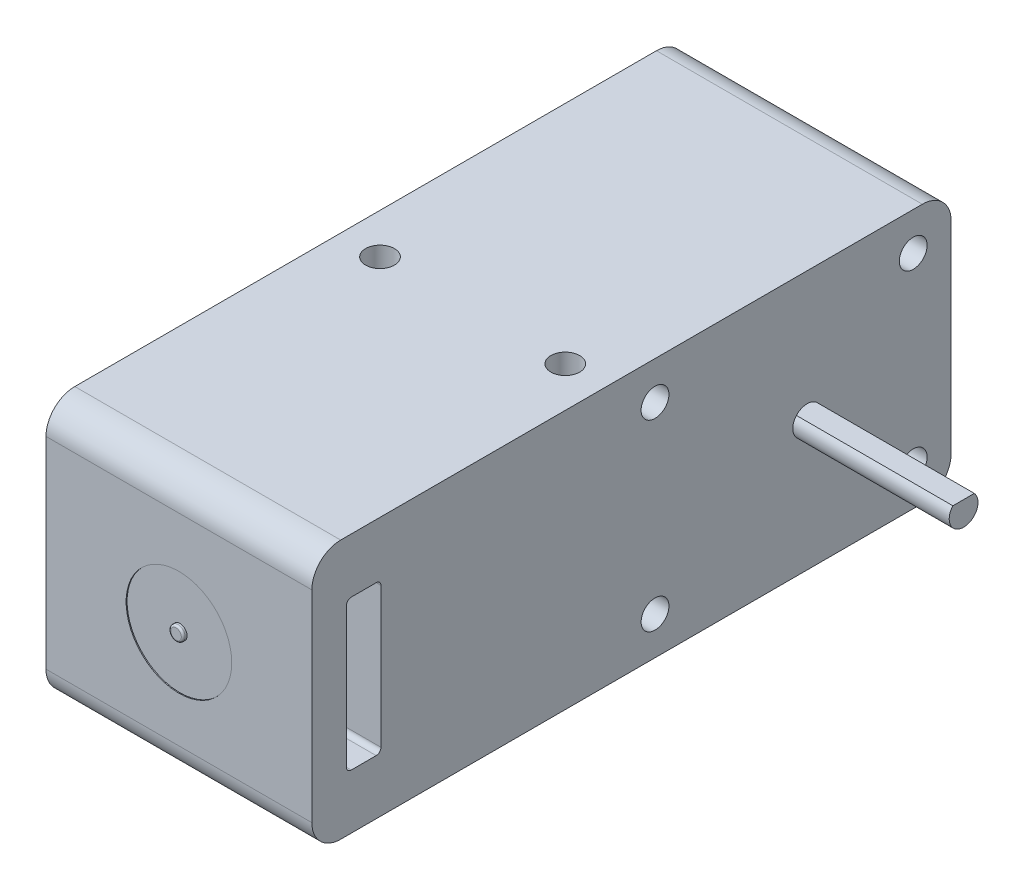
ISO-10303-21;
HEADER;
FILE_DESCRIPTION(('STEP AP214'),'2;1');
FILE_NAME('part.step','',(''),(''),'','','');
FILE_SCHEMA(('AUTOMOTIVE_DESIGN { 1 0 10303 214 1 1 1 1 }'));
ENDSEC;
DATA;
#1=APPLICATION_CONTEXT('core data for automotive mechanical design processes');
#2=APPLICATION_PROTOCOL_DEFINITION('international standard','automotive_design',2000,#1);
#3=PRODUCT_CONTEXT('',#1,'mechanical');
#4=PRODUCT('Part','Part','',(#3));
#5=PRODUCT_RELATED_PRODUCT_CATEGORY('part','',(#4));
#6=PRODUCT_DEFINITION_FORMATION('','',#4);
#7=PRODUCT_DEFINITION_CONTEXT('part definition',#1,'design');
#8=PRODUCT_DEFINITION('design','',#6,#7);
#9=PRODUCT_DEFINITION_SHAPE('','',#8);
#10=(LENGTH_UNIT() NAMED_UNIT(*) SI_UNIT(.MILLI.,.METRE.));
#11=(NAMED_UNIT(*) PLANE_ANGLE_UNIT() SI_UNIT($,.RADIAN.));
#12=(NAMED_UNIT(*) SI_UNIT($,.STERADIAN.) SOLID_ANGLE_UNIT());
#13=UNCERTAINTY_MEASURE_WITH_UNIT(LENGTH_MEASURE(1.E-05),#10,'distance_accuracy_value','');
#14=(GEOMETRIC_REPRESENTATION_CONTEXT(3) GLOBAL_UNCERTAINTY_ASSIGNED_CONTEXT((#13)) GLOBAL_UNIT_ASSIGNED_CONTEXT((#10,
#11,#12)) REPRESENTATION_CONTEXT('',''));
#15=CARTESIAN_POINT('',(0.,0.,0.));
#16=DIRECTION('',(0.,0.,1.));
#17=DIRECTION('',(1.,0.,0.));
#18=AXIS2_PLACEMENT_3D('',#15,#16,#17);
#19=CARTESIAN_POINT('',(27.7,0.,-23.8963455149502));
#20=DIRECTION('',(0.,0.,-1.));
#21=DIRECTION('',(-1.,0.,0.));
#22=AXIS2_PLACEMENT_3D('',#19,#20,#21);
#23=PLANE('',#22);
#24=DIRECTION('',(0.,-1.,0.));
#25=VECTOR('',#24,1.);
#26=CARTESIAN_POINT('',(27.7,0.,-23.8963455149502));
#27=LINE('',#26,#25);
#28=CARTESIAN_POINT('',(27.7,6.22838257341868,-23.8963455149502));
#29=VERTEX_POINT('',#28);
#30=CARTESIAN_POINT('',(27.7,-14.7716174265813,-23.8963455149502));
#31=VERTEX_POINT('',#30);
#32=EDGE_CURVE('E229',#29,#31,#27,.T.);
#33=ORIENTED_EDGE('',*,*,#32,.T.);
#34=DIRECTION('',(-1.,0.,0.));
#35=VECTOR('',#34,1.);
#36=CARTESIAN_POINT('',(0.,-14.7716174265813,-23.8963455149502));
#37=LINE('',#36,#35);
#38=CARTESIAN_POINT('',(0.,-14.7716174265813,-23.8963455149502));
#39=VERTEX_POINT('',#38);
#40=EDGE_CURVE('E296',#31,#39,#37,.T.);
#41=ORIENTED_EDGE('',*,*,#40,.T.);
#42=DIRECTION('',(0.,-1.,0.));
#43=VECTOR('',#42,1.);
#44=CARTESIAN_POINT('',(0.,0.,-23.8963455149502));
#45=LINE('',#44,#43);
#46=CARTESIAN_POINT('',(0.,6.22838257341868,-23.8963455149502));
#47=VERTEX_POINT('',#46);
#48=EDGE_CURVE('E269',#47,#39,#45,.T.);
#49=ORIENTED_EDGE('',*,*,#48,.F.);
#50=DIRECTION('',(-1.,0.,0.));
#51=VECTOR('',#50,1.);
#52=CARTESIAN_POINT('',(27.7,6.22838257341868,-23.8963455149502));
#53=LINE('',#52,#51);
#54=EDGE_CURVE('E256',#47,#29,#53,.F.);
#55=ORIENTED_EDGE('',*,*,#54,.T.);
#56=EDGE_LOOP('',(#33,#41,#49,#55));
#57=FACE_BOUND('',#56,.T.);
#58=ADVANCED_FACE('F35',(#57),#23,.T.);
#59=CARTESIAN_POINT('',(27.7,9.22838257341868,0.));
#60=DIRECTION('',(0.,1.,0.));
#61=DIRECTION('',(0.,0.,1.));
#62=AXIS2_PLACEMENT_3D('',#59,#60,#61);
#63=PLANE('',#62);
#64=CARTESIAN_POINT('',(4.2,9.22838257341868,12.1036544850498));
#65=DIRECTION('',(0.,1.,0.));
#66=DIRECTION('',(0.,0.,1.));
#67=AXIS2_PLACEMENT_3D('',#64,#65,#66);
#68=CIRCLE('',#67,1.5);
#69=CARTESIAN_POINT('',(4.2,9.22838257341868,13.6036544850498));
#70=VERTEX_POINT('',#69);
#71=EDGE_CURVE('E211',#70,#70,#68,.T.);
#72=ORIENTED_EDGE('',*,*,#71,.F.);
#73=EDGE_LOOP('',(#72));
#74=FACE_BOUND('',#73,.T.);
#75=CARTESIAN_POINT('',(23.5,9.22838257341868,12.1036544850498));
#76=DIRECTION('',(0.,1.,0.));
#77=DIRECTION('',(0.,0.,1.));
#78=AXIS2_PLACEMENT_3D('',#75,#76,#77);
#79=CIRCLE('',#78,1.5);
#80=CARTESIAN_POINT('',(23.5,9.22838257341868,13.6036544850498));
#81=VERTEX_POINT('',#80);
#82=EDGE_CURVE('E210',#81,#81,#79,.T.);
#83=ORIENTED_EDGE('',*,*,#82,.F.);
#84=EDGE_LOOP('',(#83));
#85=FACE_BOUND('',#84,.T.);
#86=DIRECTION('',(0.,0.,-1.));
#87=VECTOR('',#86,1.);
#88=CARTESIAN_POINT('',(27.7,9.22838257341868,0.));
#89=LINE('',#88,#87);
#90=CARTESIAN_POINT('',(27.7,9.22838257341868,39.7036544850498));
#91=VERTEX_POINT('',#90);
#92=CARTESIAN_POINT('',(27.7,9.22838257341868,-20.8963455149502));
#93=VERTEX_POINT('',#92);
#94=EDGE_CURVE('E232',#91,#93,#89,.T.);
#95=ORIENTED_EDGE('',*,*,#94,.T.);
#96=DIRECTION('',(-1.,0.,0.));
#97=VECTOR('',#96,1.);
#98=CARTESIAN_POINT('',(27.7,9.22838257341868,-20.8963455149502));
#99=LINE('',#98,#97);
#100=CARTESIAN_POINT('',(0.,9.22838257341868,-20.8963455149502));
#101=VERTEX_POINT('',#100);
#102=EDGE_CURVE('E327',#93,#101,#99,.T.);
#103=ORIENTED_EDGE('',*,*,#102,.T.);
#104=DIRECTION('',(0.,0.,-1.));
#105=VECTOR('',#104,1.);
#106=CARTESIAN_POINT('',(0.,9.22838257341868,0.));
#107=LINE('',#106,#105);
#108=CARTESIAN_POINT('',(0.,9.22838257341868,39.7036544850498));
#109=VERTEX_POINT('',#108);
#110=EDGE_CURVE('E272',#109,#101,#107,.T.);
#111=ORIENTED_EDGE('',*,*,#110,.F.);
#112=DIRECTION('',(-1.,0.,0.));
#113=VECTOR('',#112,1.);
#114=CARTESIAN_POINT('',(27.7,9.22838257341868,39.7036544850498));
#115=LINE('',#114,#113);
#116=EDGE_CURVE('E325',#109,#91,#115,.F.);
#117=ORIENTED_EDGE('',*,*,#116,.T.);
#118=EDGE_LOOP('',(#95,#103,#111,#117));
#119=FACE_BOUND('',#118,.T.);
#120=ADVANCED_FACE('F385',(#74,#85,#119),#63,.T.);
#121=CARTESIAN_POINT('',(27.7,0.,42.7036544850498));
#122=DIRECTION('',(0.,0.,-1.));
#123=DIRECTION('',(-1.,0.,0.));
#124=AXIS2_PLACEMENT_3D('',#121,#122,#123);
#125=PLANE('',#124);
#126=CARTESIAN_POINT('',(13.85,-4.52161742658132,42.7036544850498));
#127=DIRECTION('',(0.,0.,1.));
#128=DIRECTION('',(1.,0.,0.));
#129=AXIS2_PLACEMENT_3D('',#126,#127,#128);
#130=CIRCLE('',#129,5.5);
#131=CARTESIAN_POINT('',(19.35,-4.52161742658132,42.7036544850498));
#132=VERTEX_POINT('',#131);
#133=EDGE_CURVE('E525',#132,#132,#130,.T.);
#134=ORIENTED_EDGE('',*,*,#133,.F.);
#135=EDGE_LOOP('',(#134));
#136=FACE_BOUND('',#135,.T.);
#137=DIRECTION('',(0.,-1.,0.));
#138=VECTOR('',#137,1.);
#139=CARTESIAN_POINT('',(0.,0.,42.7036544850498));
#140=LINE('',#139,#138);
#141=CARTESIAN_POINT('',(0.,6.22838257341868,42.7036544850498));
#142=VERTEX_POINT('',#141);
#143=CARTESIAN_POINT('',(0.,-14.7716174265813,42.7036544850498));
#144=VERTEX_POINT('',#143);
#145=EDGE_CURVE('E275',#142,#144,#140,.T.);
#146=ORIENTED_EDGE('',*,*,#145,.T.);
#147=DIRECTION('',(-1.,0.,0.));
#148=VECTOR('',#147,1.);
#149=CARTESIAN_POINT('',(27.7,-14.7716174265813,42.7036544850498));
#150=LINE('',#149,#148);
#151=CARTESIAN_POINT('',(27.7,-14.7716174265813,42.7036544850498));
#152=VERTEX_POINT('',#151);
#153=EDGE_CURVE('E323',#144,#152,#150,.F.);
#154=ORIENTED_EDGE('',*,*,#153,.T.);
#155=DIRECTION('',(0.,-1.,0.));
#156=VECTOR('',#155,1.);
#157=CARTESIAN_POINT('',(27.7,0.,42.7036544850498));
#158=LINE('',#157,#156);
#159=CARTESIAN_POINT('',(27.7,6.22838257341868,42.7036544850498));
#160=VERTEX_POINT('',#159);
#161=EDGE_CURVE('E235',#160,#152,#158,.T.);
#162=ORIENTED_EDGE('',*,*,#161,.F.);
#163=DIRECTION('',(-1.,0.,0.));
#164=VECTOR('',#163,1.);
#165=CARTESIAN_POINT('',(0.,6.22838257341868,42.7036544850498));
#166=LINE('',#165,#164);
#167=EDGE_CURVE('E320',#160,#142,#166,.T.);
#168=ORIENTED_EDGE('',*,*,#167,.T.);
#169=EDGE_LOOP('',(#146,#154,#162,#168));
#170=FACE_BOUND('',#169,.T.);
#171=ADVANCED_FACE('F391',(#136,#170),#125,.F.);
#172=CARTESIAN_POINT('',(27.7,0.,39.1036544850498));
#173=DIRECTION('',(0.,0.,-1.));
#174=DIRECTION('',(-1.,0.,0.));
#175=AXIS2_PLACEMENT_3D('',#172,#173,#174);
#176=PLANE('',#175);
#177=CARTESIAN_POINT('',(13.85,-4.27161742658132,39.1036544850498));
#178=DIRECTION('',(0.,0.,-1.));
#179=DIRECTION('',(-1.,0.,0.));
#180=AXIS2_PLACEMENT_3D('',#177,#178,#179);
#181=CIRCLE('',#180,7.25);
#182=CARTESIAN_POINT('',(6.6,-4.27161742658132,39.1036544850498));
#183=VERTEX_POINT('',#182);
#184=EDGE_CURVE('E192',#183,#183,#181,.T.);
#185=ORIENTED_EDGE('',*,*,#184,.F.);
#186=EDGE_LOOP('',(#185));
#187=FACE_BOUND('',#186,.T.);
#188=DIRECTION('',(0.,-1.,0.));
#189=VECTOR('',#188,1.);
#190=CARTESIAN_POINT('',(27.7,0.,39.1036544850498));
#191=LINE('',#190,#189);
#192=CARTESIAN_POINT('',(27.7,3.02838257341868,39.1036544850498));
#193=VERTEX_POINT('',#192);
#194=CARTESIAN_POINT('',(27.7,-11.5716174265813,39.1036544850498));
#195=VERTEX_POINT('',#194);
#196=EDGE_CURVE('E217',#193,#195,#191,.T.);
#197=ORIENTED_EDGE('',*,*,#196,.T.);
#198=DIRECTION('',(-1.,0.,0.));
#199=VECTOR('',#198,1.);
#200=CARTESIAN_POINT('',(0.,-11.5716174265813,39.1036544850498));
#201=LINE('',#200,#199);
#202=CARTESIAN_POINT('',(0.,-11.5716174265813,39.1036544850498));
#203=VERTEX_POINT('',#202);
#204=EDGE_CURVE('E342',#195,#203,#201,.T.);
#205=ORIENTED_EDGE('',*,*,#204,.T.);
#206=DIRECTION('',(0.,-1.,0.));
#207=VECTOR('',#206,1.);
#208=CARTESIAN_POINT('',(0.,0.,39.1036544850498));
#209=LINE('',#208,#207);
#210=CARTESIAN_POINT('',(0.,3.02838257341868,39.1036544850498));
#211=VERTEX_POINT('',#210);
#212=EDGE_CURVE('E257',#211,#203,#209,.T.);
#213=ORIENTED_EDGE('',*,*,#212,.F.);
#214=DIRECTION('',(-1.,0.,0.));
#215=VECTOR('',#214,1.);
#216=CARTESIAN_POINT('',(27.7,3.02838257341868,39.1036544850498));
#217=LINE('',#216,#215);
#218=EDGE_CURVE('E340',#211,#193,#217,.F.);
#219=ORIENTED_EDGE('',*,*,#218,.T.);
#220=EDGE_LOOP('',(#197,#205,#213,#219));
#221=FACE_BOUND('',#220,.T.);
#222=ADVANCED_FACE('F410',(#187,#221),#176,.T.);
#223=CARTESIAN_POINT('',(27.7,3.52838257341868,0.));
#224=DIRECTION('',(0.,1.,0.));
#225=DIRECTION('',(0.,0.,1.));
#226=AXIS2_PLACEMENT_3D('',#223,#224,#225);
#227=PLANE('',#226);
#228=DIRECTION('',(0.,0.,-1.));
#229=VECTOR('',#228,1.);
#230=CARTESIAN_POINT('',(27.7,3.52838257341868,0.));
#231=LINE('',#230,#229);
#232=CARTESIAN_POINT('',(27.7,3.52838257341868,38.6036544850498));
#233=VERTEX_POINT('',#232);
#234=CARTESIAN_POINT('',(27.7,3.52838257341868,36.0036544850498));
#235=VERTEX_POINT('',#234);
#236=EDGE_CURVE('E220',#233,#235,#231,.T.);
#237=ORIENTED_EDGE('',*,*,#236,.F.);
#238=DIRECTION('',(-1.,0.,0.));
#239=VECTOR('',#238,1.);
#240=CARTESIAN_POINT('',(27.7,3.52838257341868,38.6036544850498));
#241=LINE('',#240,#239);
#242=CARTESIAN_POINT('',(0.,3.52838257341868,38.6036544850498));
#243=VERTEX_POINT('',#242);
#244=EDGE_CURVE('E346',#233,#243,#241,.T.);
#245=ORIENTED_EDGE('',*,*,#244,.T.);
#246=DIRECTION('',(0.,0.,-1.));
#247=VECTOR('',#246,1.);
#248=CARTESIAN_POINT('',(0.,3.52838257341868,0.));
#249=LINE('',#248,#247);
#250=CARTESIAN_POINT('',(0.,3.52838257341868,36.0036544850498));
#251=VERTEX_POINT('',#250);
#252=EDGE_CURVE('E260',#243,#251,#249,.T.);
#253=ORIENTED_EDGE('',*,*,#252,.T.);
#254=DIRECTION('',(-1.,0.,0.));
#255=VECTOR('',#254,1.);
#256=CARTESIAN_POINT('',(27.7,3.52838257341868,36.0036544850498));
#257=LINE('',#256,#255);
#258=EDGE_CURVE('E58',#251,#235,#257,.F.);
#259=ORIENTED_EDGE('',*,*,#258,.T.);
#260=EDGE_LOOP('',(#237,#245,#253,#259));
#261=FACE_BOUND('',#260,.T.);
#262=ADVANCED_FACE('F406',(#261),#227,.F.);
#263=CARTESIAN_POINT('',(27.7,0.,35.5036544850498));
#264=DIRECTION('',(0.,0.,-1.));
#265=DIRECTION('',(-1.,0.,0.));
#266=AXIS2_PLACEMENT_3D('',#263,#264,#265);
#267=PLANE('',#266);
#268=CARTESIAN_POINT('',(13.85,-4.27161742658132,35.5036544850498));
#269=DIRECTION('',(0.,0.,-1.));
#270=DIRECTION('',(-1.,0.,0.));
#271=AXIS2_PLACEMENT_3D('',#268,#269,#270);
#272=CIRCLE('',#271,7.25);
#273=CARTESIAN_POINT('',(6.6,-4.27161742658132,35.5036544850498));
#274=VERTEX_POINT('',#273);
#275=EDGE_CURVE('E365',#274,#274,#272,.F.);
#276=ORIENTED_EDGE('',*,*,#275,.F.);
#277=EDGE_LOOP('',(#276));
#278=FACE_BOUND('',#277,.T.);
#279=DIRECTION('',(0.,-1.,0.));
#280=VECTOR('',#279,1.);
#281=CARTESIAN_POINT('',(0.,0.,35.5036544850498));
#282=LINE('',#281,#280);
#283=CARTESIAN_POINT('',(0.,3.02838257341868,35.5036544850498));
#284=VERTEX_POINT('',#283);
#285=CARTESIAN_POINT('',(0.,-11.5716174265813,35.5036544850498));
#286=VERTEX_POINT('',#285);
#287=EDGE_CURVE('E263',#284,#286,#282,.T.);
#288=ORIENTED_EDGE('',*,*,#287,.T.);
#289=DIRECTION('',(-1.,0.,0.));
#290=VECTOR('',#289,1.);
#291=CARTESIAN_POINT('',(27.7,-11.5716174265813,35.5036544850498));
#292=LINE('',#291,#290);
#293=CARTESIAN_POINT('',(27.7,-11.5716174265813,35.5036544850498));
#294=VERTEX_POINT('',#293);
#295=EDGE_CURVE('E338',#286,#294,#292,.F.);
#296=ORIENTED_EDGE('',*,*,#295,.T.);
#297=DIRECTION('',(0.,-1.,0.));
#298=VECTOR('',#297,1.);
#299=CARTESIAN_POINT('',(27.7,0.,35.5036544850498));
#300=LINE('',#299,#298);
#301=CARTESIAN_POINT('',(27.7,3.02838257341868,35.5036544850498));
#302=VERTEX_POINT('',#301);
#303=EDGE_CURVE('E223',#302,#294,#300,.T.);
#304=ORIENTED_EDGE('',*,*,#303,.F.);
#305=DIRECTION('',(-1.,0.,0.));
#306=VECTOR('',#305,1.);
#307=CARTESIAN_POINT('',(0.,3.02838257341868,35.5036544850498));
#308=LINE('',#307,#306);
#309=EDGE_CURVE('E335',#302,#284,#308,.T.);
#310=ORIENTED_EDGE('',*,*,#309,.T.);
#311=EDGE_LOOP('',(#288,#296,#304,#310));
#312=FACE_BOUND('',#311,.T.);
#313=ADVANCED_FACE('F402',(#278,#312),#267,.F.);
#314=CARTESIAN_POINT('',(27.7,5.27838257341868,-19.9463455149501));
#315=DIRECTION('',(-1.,0.,0.));
#316=DIRECTION('',(0.,0.,1.));
#317=AXIS2_PLACEMENT_3D('',#314,#315,#316);
#318=CYLINDRICAL_SURFACE('',#317,1.45);
#319=CARTESIAN_POINT('',(27.7,5.27838257341868,-19.9463455149501));
#320=DIRECTION('',(1.,0.,0.));
#321=DIRECTION('',(0.,0.,-1.));
#322=AXIS2_PLACEMENT_3D('',#319,#320,#321);
#323=CIRCLE('',#322,1.45);
#324=CARTESIAN_POINT('',(27.7,5.27838257341868,-21.3963455149501));
#325=VERTEX_POINT('',#324);
#326=EDGE_CURVE('E250',#325,#325,#323,.T.);
#327=ORIENTED_EDGE('',*,*,#326,.T.);
#328=EDGE_LOOP('',(#327));
#329=FACE_BOUND('',#328,.T.);
#330=CARTESIAN_POINT('',(0.,5.27838257341868,-19.9463455149501));
#331=DIRECTION('',(1.,0.,0.));
#332=DIRECTION('',(0.,0.,-1.));
#333=AXIS2_PLACEMENT_3D('',#330,#331,#332);
#334=CIRCLE('',#333,1.45);
#335=CARTESIAN_POINT('',(0.,5.27838257341868,-21.3963455149501));
#336=VERTEX_POINT('',#335);
#337=EDGE_CURVE('E290',#336,#336,#334,.T.);
#338=ORIENTED_EDGE('',*,*,#337,.F.);
#339=EDGE_LOOP('',(#338));
#340=FACE_BOUND('',#339,.T.);
#341=ADVANCED_FACE('F405',(#329,#340),#318,.F.);
#342=CARTESIAN_POINT('',(27.7,-13.8216174265813,-19.9463455149501));
#343=DIRECTION('',(-1.,0.,0.));
#344=DIRECTION('',(0.,0.,1.));
#345=AXIS2_PLACEMENT_3D('',#342,#343,#344);
#346=CYLINDRICAL_SURFACE('',#345,1.45);
#347=CARTESIAN_POINT('',(27.7,-13.8216174265813,-19.9463455149501));
#348=DIRECTION('',(1.,0.,0.));
#349=DIRECTION('',(0.,0.,-1.));
#350=AXIS2_PLACEMENT_3D('',#347,#348,#349);
#351=CIRCLE('',#350,1.45);
#352=CARTESIAN_POINT('',(27.7,-13.8216174265813,-21.3963455149501));
#353=VERTEX_POINT('',#352);
#354=EDGE_CURVE('E247',#353,#353,#351,.T.);
#355=ORIENTED_EDGE('',*,*,#354,.T.);
#356=EDGE_LOOP('',(#355));
#357=FACE_BOUND('',#356,.T.);
#358=CARTESIAN_POINT('',(0.,-13.8216174265813,-19.9463455149501));
#359=DIRECTION('',(1.,0.,0.));
#360=DIRECTION('',(0.,0.,-1.));
#361=AXIS2_PLACEMENT_3D('',#358,#359,#360);
#362=CIRCLE('',#361,1.45);
#363=CARTESIAN_POINT('',(0.,-13.8216174265813,-21.3963455149501));
#364=VERTEX_POINT('',#363);
#365=EDGE_CURVE('E287',#364,#364,#362,.T.);
#366=ORIENTED_EDGE('',*,*,#365,.F.);
#367=EDGE_LOOP('',(#366));
#368=FACE_BOUND('',#367,.T.);
#369=ADVANCED_FACE('F501',(#357,#368),#346,.F.);
#370=CARTESIAN_POINT('',(27.7,-13.8216174265813,6.95365448504986));
#371=DIRECTION('',(-1.,0.,0.));
#372=DIRECTION('',(0.,0.,1.));
#373=AXIS2_PLACEMENT_3D('',#370,#371,#372);
#374=CYLINDRICAL_SURFACE('',#373,1.45);
#375=CARTESIAN_POINT('',(27.7,-13.8216174265813,6.95365448504986));
#376=DIRECTION('',(1.,0.,0.));
#377=DIRECTION('',(0.,0.,-1.));
#378=AXIS2_PLACEMENT_3D('',#375,#376,#377);
#379=CIRCLE('',#378,1.45);
#380=CARTESIAN_POINT('',(27.7,-13.8216174265813,5.50365448504986));
#381=VERTEX_POINT('',#380);
#382=EDGE_CURVE('E244',#381,#381,#379,.T.);
#383=ORIENTED_EDGE('',*,*,#382,.T.);
#384=EDGE_LOOP('',(#383));
#385=FACE_BOUND('',#384,.T.);
#386=CARTESIAN_POINT('',(0.,-13.8216174265813,6.95365448504986));
#387=DIRECTION('',(1.,0.,0.));
#388=DIRECTION('',(0.,0.,-1.));
#389=AXIS2_PLACEMENT_3D('',#386,#387,#388);
#390=CIRCLE('',#389,1.45);
#391=CARTESIAN_POINT('',(0.,-13.8216174265813,5.50365448504986));
#392=VERTEX_POINT('',#391);
#393=EDGE_CURVE('E284',#392,#392,#390,.T.);
#394=ORIENTED_EDGE('',*,*,#393,.F.);
#395=EDGE_LOOP('',(#394));
#396=FACE_BOUND('',#395,.T.);
#397=ADVANCED_FACE('F505',(#385,#396),#374,.F.);
#398=CARTESIAN_POINT('',(27.7,-4.27161742658132,-8.89634551495015));
#399=DIRECTION('',(-1.,0.,0.));
#400=DIRECTION('',(0.,0.,1.));
#401=AXIS2_PLACEMENT_3D('',#398,#399,#400);
#402=CYLINDRICAL_SURFACE('',#401,1.5);
#403=DIRECTION('',(-1.,0.,0.));
#404=VECTOR('',#403,1.);
#405=CARTESIAN_POINT('',(44.,-3.27161742658132,-10.0143795037));
#406=LINE('',#405,#404);
#407=CARTESIAN_POINT('',(27.7,-3.27161742658132,-10.0143795037));
#408=VERTEX_POINT('',#407);
#409=CARTESIAN_POINT('',(0.,-3.27161742658132,-10.0143795037));
#410=VERTEX_POINT('',#409);
#411=EDGE_CURVE('E199',#408,#410,#406,.T.);
#412=ORIENTED_EDGE('',*,*,#411,.F.);
#413=CARTESIAN_POINT('',(27.7,-4.27161742658132,-8.89634551495015));
#414=DIRECTION('',(1.,0.,0.));
#415=DIRECTION('',(0.,0.,-1.));
#416=AXIS2_PLACEMENT_3D('',#413,#414,#415);
#417=CIRCLE('',#416,1.5);
#418=CARTESIAN_POINT('',(27.7,-3.27161742658132,-7.77831152620026));
#419=VERTEX_POINT('',#418);
#420=EDGE_CURVE('E241',#408,#419,#417,.T.);
#421=ORIENTED_EDGE('',*,*,#420,.T.);
#422=DIRECTION('',(-1.,0.,0.));
#423=VECTOR('',#422,1.);
#424=CARTESIAN_POINT('',(44.,-3.27161742658132,-7.77831152620026));
#425=LINE('',#424,#423);
#426=CARTESIAN_POINT('',(0.,-3.27161742658132,-7.77831152620026));
#427=VERTEX_POINT('',#426);
#428=EDGE_CURVE('E203',#419,#427,#425,.T.);
#429=ORIENTED_EDGE('',*,*,#428,.T.);
#430=CARTESIAN_POINT('',(0.,-4.27161742658132,-8.89634551495015));
#431=DIRECTION('',(1.,0.,0.));
#432=DIRECTION('',(0.,0.,-1.));
#433=AXIS2_PLACEMENT_3D('',#430,#431,#432);
#434=CIRCLE('',#433,1.5);
#435=EDGE_CURVE('E281',#410,#427,#434,.T.);
#436=ORIENTED_EDGE('',*,*,#435,.F.);
#437=EDGE_LOOP('',(#412,#421,#429,#436));
#438=FACE_BOUND('',#437,.T.);
#439=ADVANCED_FACE('F509',(#438),#402,.F.);
#440=CARTESIAN_POINT('',(27.7,-17.7716174265813,0.));
#441=DIRECTION('',(0.,1.,0.));
#442=DIRECTION('',(0.,0.,1.));
#443=AXIS2_PLACEMENT_3D('',#440,#441,#442);
#444=PLANE('',#443);
#445=CARTESIAN_POINT('',(4.2,-17.7716174265813,12.1036544850498));
#446=DIRECTION('',(0.,1.,0.));
#447=DIRECTION('',(0.,0.,1.));
#448=AXIS2_PLACEMENT_3D('',#445,#446,#447);
#449=CIRCLE('',#448,1.5);
#450=CARTESIAN_POINT('',(4.2,-17.7716174265813,13.6036544850498));
#451=VERTEX_POINT('',#450);
#452=EDGE_CURVE('E261',#451,#451,#449,.T.);
#453=ORIENTED_EDGE('',*,*,#452,.T.);
#454=EDGE_LOOP('',(#453));
#455=FACE_BOUND('',#454,.T.);
#456=CARTESIAN_POINT('',(23.5,-17.7716174265813,12.1036544850498));
#457=DIRECTION('',(0.,1.,0.));
#458=DIRECTION('',(0.,0.,1.));
#459=AXIS2_PLACEMENT_3D('',#456,#457,#458);
#460=CIRCLE('',#459,1.5);
#461=CARTESIAN_POINT('',(23.5,-17.7716174265813,13.6036544850498));
#462=VERTEX_POINT('',#461);
#463=EDGE_CURVE('E214',#462,#462,#460,.T.);
#464=ORIENTED_EDGE('',*,*,#463,.T.);
#465=EDGE_LOOP('',(#464));
#466=FACE_BOUND('',#465,.T.);
#467=DIRECTION('',(0.,0.,-1.));
#468=VECTOR('',#467,1.);
#469=CARTESIAN_POINT('',(0.,-17.7716174265813,0.));
#470=LINE('',#469,#468);
#471=CARTESIAN_POINT('',(0.,-17.7716174265813,39.7036544850498));
#472=VERTEX_POINT('',#471);
#473=CARTESIAN_POINT('',(0.,-17.7716174265813,-20.8963455149502));
#474=VERTEX_POINT('',#473);
#475=EDGE_CURVE('E278',#472,#474,#470,.T.);
#476=ORIENTED_EDGE('',*,*,#475,.T.);
#477=DIRECTION('',(-1.,0.,0.));
#478=VECTOR('',#477,1.);
#479=CARTESIAN_POINT('',(27.7,-17.7716174265813,-20.8963455149502));
#480=LINE('',#479,#478);
#481=CARTESIAN_POINT('',(27.7,-17.7716174265813,-20.8963455149502));
#482=VERTEX_POINT('',#481);
#483=EDGE_CURVE('E310',#474,#482,#480,.F.);
#484=ORIENTED_EDGE('',*,*,#483,.T.);
#485=DIRECTION('',(0.,0.,-1.));
#486=VECTOR('',#485,1.);
#487=CARTESIAN_POINT('',(27.7,-17.7716174265813,0.));
#488=LINE('',#487,#486);
#489=CARTESIAN_POINT('',(27.7,-17.7716174265813,39.7036544850498));
#490=VERTEX_POINT('',#489);
#491=EDGE_CURVE('E238',#490,#482,#488,.T.);
#492=ORIENTED_EDGE('',*,*,#491,.F.);
#493=DIRECTION('',(-1.,0.,0.));
#494=VECTOR('',#493,1.);
#495=CARTESIAN_POINT('',(27.7,-17.7716174265813,39.7036544850498));
#496=LINE('',#495,#494);
#497=EDGE_CURVE('E307',#490,#472,#496,.T.);
#498=ORIENTED_EDGE('',*,*,#497,.T.);
#499=EDGE_LOOP('',(#476,#484,#492,#498));
#500=FACE_BOUND('',#499,.T.);
#501=ADVANCED_FACE('F400',(#455,#466,#500),#444,.F.);
#502=CARTESIAN_POINT('',(27.7,-12.0716174265813,0.));
#503=DIRECTION('',(0.,1.,0.));
#504=DIRECTION('',(0.,0.,1.));
#505=AXIS2_PLACEMENT_3D('',#502,#503,#504);
#506=PLANE('',#505);
#507=DIRECTION('',(0.,0.,-1.));
#508=VECTOR('',#507,1.);
#509=CARTESIAN_POINT('',(27.7,-12.0716174265813,0.));
#510=LINE('',#509,#508);
#511=CARTESIAN_POINT('',(27.7,-12.0716174265813,38.6036544850498));
#512=VERTEX_POINT('',#511);
#513=CARTESIAN_POINT('',(27.7,-12.0716174265813,36.0036544850498));
#514=VERTEX_POINT('',#513);
#515=EDGE_CURVE('E226',#512,#514,#510,.T.);
#516=ORIENTED_EDGE('',*,*,#515,.T.);
#517=DIRECTION('',(-1.,0.,0.));
#518=VECTOR('',#517,1.);
#519=CARTESIAN_POINT('',(27.7,-12.0716174265813,36.0036544850498));
#520=LINE('',#519,#518);
#521=CARTESIAN_POINT('',(0.,-12.0716174265813,36.0036544850498));
#522=VERTEX_POINT('',#521);
#523=EDGE_CURVE('E332',#514,#522,#520,.T.);
#524=ORIENTED_EDGE('',*,*,#523,.T.);
#525=DIRECTION('',(0.,0.,-1.));
#526=VECTOR('',#525,1.);
#527=CARTESIAN_POINT('',(0.,-12.0716174265813,0.));
#528=LINE('',#527,#526);
#529=CARTESIAN_POINT('',(0.,-12.0716174265813,38.6036544850498));
#530=VERTEX_POINT('',#529);
#531=EDGE_CURVE('E266',#530,#522,#528,.T.);
#532=ORIENTED_EDGE('',*,*,#531,.F.);
#533=DIRECTION('',(-1.,0.,0.));
#534=VECTOR('',#533,1.);
#535=CARTESIAN_POINT('',(27.7,-12.0716174265813,38.6036544850498));
#536=LINE('',#535,#534);
#537=EDGE_CURVE('E330',#530,#512,#536,.F.);
#538=ORIENTED_EDGE('',*,*,#537,.T.);
#539=EDGE_LOOP('',(#516,#524,#532,#538));
#540=FACE_BOUND('',#539,.T.);
#541=ADVANCED_FACE('F396',(#540),#506,.T.);
#542=CARTESIAN_POINT('',(27.7,5.27838257341868,6.95365448504986));
#543=DIRECTION('',(-1.,0.,0.));
#544=DIRECTION('',(0.,0.,1.));
#545=AXIS2_PLACEMENT_3D('',#542,#543,#544);
#546=CYLINDRICAL_SURFACE('',#545,1.45);
#547=CARTESIAN_POINT('',(27.7,5.27838257341868,6.95365448504986));
#548=DIRECTION('',(1.,0.,0.));
#549=DIRECTION('',(0.,0.,-1.));
#550=AXIS2_PLACEMENT_3D('',#547,#548,#549);
#551=CIRCLE('',#550,1.45);
#552=CARTESIAN_POINT('',(27.7,5.27838257341868,5.50365448504986));
#553=VERTEX_POINT('',#552);
#554=EDGE_CURVE('E253',#553,#553,#551,.T.);
#555=ORIENTED_EDGE('',*,*,#554,.T.);
#556=EDGE_LOOP('',(#555));
#557=FACE_BOUND('',#556,.T.);
#558=CARTESIAN_POINT('',(0.,5.27838257341868,6.95365448504986));
#559=DIRECTION('',(1.,0.,0.));
#560=DIRECTION('',(0.,0.,-1.));
#561=AXIS2_PLACEMENT_3D('',#558,#559,#560);
#562=CIRCLE('',#561,1.45);
#563=CARTESIAN_POINT('',(0.,5.27838257341868,5.50365448504986));
#564=VERTEX_POINT('',#563);
#565=EDGE_CURVE('E221',#564,#564,#562,.T.);
#566=ORIENTED_EDGE('',*,*,#565,.F.);
#567=EDGE_LOOP('',(#566));
#568=FACE_BOUND('',#567,.T.);
#569=ADVANCED_FACE('F399',(#557,#568),#546,.F.);
#570=CARTESIAN_POINT('',(27.7,0.,0.));
#571=DIRECTION('',(1.,0.,0.));
#572=DIRECTION('',(0.,0.,-1.));
#573=AXIS2_PLACEMENT_3D('',#570,#571,#572);
#574=PLANE('',#573);
#575=ORIENTED_EDGE('',*,*,#196,.F.);
#576=CARTESIAN_POINT('',(27.7,3.02838257341868,38.6036544850498));
#577=DIRECTION('',(1.,0.,0.));
#578=DIRECTION('',(0.,0.,-1.));
#579=AXIS2_PLACEMENT_3D('',#576,#577,#578);
#580=CIRCLE('',#579,0.5);
#581=EDGE_CURVE('E359',#193,#233,#580,.F.);
#582=ORIENTED_EDGE('',*,*,#581,.T.);
#583=ORIENTED_EDGE('',*,*,#236,.T.);
#584=CARTESIAN_POINT('',(27.7,3.02838257341868,36.0036544850498));
#585=DIRECTION('',(1.,0.,0.));
#586=DIRECTION('',(0.,0.,-1.));
#587=AXIS2_PLACEMENT_3D('',#584,#585,#586);
#588=CIRCLE('',#587,0.5);
#589=EDGE_CURVE('E363',#235,#302,#588,.F.);
#590=ORIENTED_EDGE('',*,*,#589,.T.);
#591=ORIENTED_EDGE('',*,*,#303,.T.);
#592=CARTESIAN_POINT('',(27.7,-11.5716174265813,36.0036544850498));
#593=DIRECTION('',(1.,0.,0.));
#594=DIRECTION('',(0.,0.,-1.));
#595=AXIS2_PLACEMENT_3D('',#592,#593,#594);
#596=CIRCLE('',#595,0.5);
#597=EDGE_CURVE('E351',#294,#514,#596,.F.);
#598=ORIENTED_EDGE('',*,*,#597,.T.);
#599=ORIENTED_EDGE('',*,*,#515,.F.);
#600=CARTESIAN_POINT('',(27.7,-11.5716174265813,38.6036544850498));
#601=DIRECTION('',(1.,0.,0.));
#602=DIRECTION('',(0.,0.,-1.));
#603=AXIS2_PLACEMENT_3D('',#600,#601,#602);
#604=CIRCLE('',#603,0.5);
#605=EDGE_CURVE('E355',#512,#195,#604,.F.);
#606=ORIENTED_EDGE('',*,*,#605,.T.);
#607=EDGE_LOOP('',(#575,#582,#583,#590,#591,#598,#599,#606));
#608=FACE_BOUND('',#607,.T.);
#609=ORIENTED_EDGE('',*,*,#491,.T.);
#610=CARTESIAN_POINT('',(27.7,-14.7716174265813,-20.8963455149502));
#611=DIRECTION('',(1.,0.,0.));
#612=DIRECTION('',(0.,0.,-1.));
#613=AXIS2_PLACEMENT_3D('',#610,#611,#612);
#614=CIRCLE('',#613,3.);
#615=EDGE_CURVE('E318',#482,#31,#614,.T.);
#616=ORIENTED_EDGE('',*,*,#615,.T.);
#617=ORIENTED_EDGE('',*,*,#32,.F.);
#618=CARTESIAN_POINT('',(27.7,6.22838257341868,-20.8963455149502));
#619=DIRECTION('',(1.,0.,0.));
#620=DIRECTION('',(0.,0.,-1.));
#621=AXIS2_PLACEMENT_3D('',#618,#619,#620);
#622=CIRCLE('',#621,3.);
#623=EDGE_CURVE('E314',#29,#93,#622,.T.);
#624=ORIENTED_EDGE('',*,*,#623,.T.);
#625=ORIENTED_EDGE('',*,*,#94,.F.);
#626=CARTESIAN_POINT('',(27.7,6.22838257341868,39.7036544850498));
#627=DIRECTION('',(1.,0.,0.));
#628=DIRECTION('',(0.,0.,-1.));
#629=AXIS2_PLACEMENT_3D('',#626,#627,#628);
#630=CIRCLE('',#629,3.);
#631=EDGE_CURVE('E312',#91,#160,#630,.T.);
#632=ORIENTED_EDGE('',*,*,#631,.T.);
#633=ORIENTED_EDGE('',*,*,#161,.T.);
#634=CARTESIAN_POINT('',(27.7,-14.7716174265813,39.7036544850498));
#635=DIRECTION('',(1.,0.,0.));
#636=DIRECTION('',(0.,0.,-1.));
#637=AXIS2_PLACEMENT_3D('',#634,#635,#636);
#638=CIRCLE('',#637,3.);
#639=EDGE_CURVE('E316',#152,#490,#638,.T.);
#640=ORIENTED_EDGE('',*,*,#639,.T.);
#641=EDGE_LOOP('',(#609,#616,#617,#624,#625,#632,#633,#640));
#642=FACE_BOUND('',#641,.T.);
#643=ORIENTED_EDGE('',*,*,#420,.F.);
#644=CARTESIAN_POINT('',(27.7,-4.27161742658132,-8.89634551495015));
#645=DIRECTION('',(1.,0.,0.));
#646=DIRECTION('',(0.,0.,-1.));
#647=AXIS2_PLACEMENT_3D('',#644,#645,#646);
#648=CIRCLE('',#647,1.5);
#649=EDGE_CURVE('E207',#408,#419,#648,.F.);
#650=ORIENTED_EDGE('',*,*,#649,.T.);
#651=EDGE_LOOP('',(#643,#650));
#652=FACE_BOUND('',#651,.T.);
#653=ORIENTED_EDGE('',*,*,#382,.F.);
#654=EDGE_LOOP('',(#653));
#655=FACE_BOUND('',#654,.T.);
#656=ORIENTED_EDGE('',*,*,#354,.F.);
#657=EDGE_LOOP('',(#656));
#658=FACE_BOUND('',#657,.T.);
#659=ORIENTED_EDGE('',*,*,#326,.F.);
#660=EDGE_LOOP('',(#659));
#661=FACE_BOUND('',#660,.T.);
#662=ORIENTED_EDGE('',*,*,#554,.F.);
#663=EDGE_LOOP('',(#662));
#664=FACE_BOUND('',#663,.T.);
#665=ADVANCED_FACE('F457',(#608,#642,#652,#655,#658,#661,#664),#574,.T.);
#666=CARTESIAN_POINT('',(0.,0.,0.));
#667=DIRECTION('',(1.,0.,0.));
#668=DIRECTION('',(0.,0.,-1.));
#669=AXIS2_PLACEMENT_3D('',#666,#667,#668);
#670=PLANE('',#669);
#671=ORIENTED_EDGE('',*,*,#252,.F.);
#672=CARTESIAN_POINT('',(0.,3.02838257341868,38.6036544850498));
#673=DIRECTION('',(1.,0.,0.));
#674=DIRECTION('',(0.,0.,-1.));
#675=AXIS2_PLACEMENT_3D('',#672,#673,#674);
#676=CIRCLE('',#675,0.5);
#677=EDGE_CURVE('E357',#243,#211,#676,.T.);
#678=ORIENTED_EDGE('',*,*,#677,.T.);
#679=ORIENTED_EDGE('',*,*,#212,.T.);
#680=CARTESIAN_POINT('',(0.,-11.5716174265813,38.6036544850498));
#681=DIRECTION('',(1.,0.,0.));
#682=DIRECTION('',(0.,0.,-1.));
#683=AXIS2_PLACEMENT_3D('',#680,#681,#682);
#684=CIRCLE('',#683,0.5);
#685=EDGE_CURVE('E353',#203,#530,#684,.T.);
#686=ORIENTED_EDGE('',*,*,#685,.T.);
#687=ORIENTED_EDGE('',*,*,#531,.T.);
#688=CARTESIAN_POINT('',(0.,-11.5716174265813,36.0036544850498));
#689=DIRECTION('',(1.,0.,0.));
#690=DIRECTION('',(0.,0.,-1.));
#691=AXIS2_PLACEMENT_3D('',#688,#689,#690);
#692=CIRCLE('',#691,0.5);
#693=EDGE_CURVE('E349',#522,#286,#692,.T.);
#694=ORIENTED_EDGE('',*,*,#693,.T.);
#695=ORIENTED_EDGE('',*,*,#287,.F.);
#696=CARTESIAN_POINT('',(0.,3.02838257341868,36.0036544850498));
#697=DIRECTION('',(1.,0.,0.));
#698=DIRECTION('',(0.,0.,-1.));
#699=AXIS2_PLACEMENT_3D('',#696,#697,#698);
#700=CIRCLE('',#699,0.5);
#701=EDGE_CURVE('E361',#284,#251,#700,.T.);
#702=ORIENTED_EDGE('',*,*,#701,.T.);
#703=EDGE_LOOP('',(#671,#678,#679,#686,#687,#694,#695,#702));
#704=FACE_BOUND('',#703,.T.);
#705=ORIENTED_EDGE('',*,*,#48,.T.);
#706=CARTESIAN_POINT('',(0.,-14.7716174265813,-20.8963455149502));
#707=DIRECTION('',(1.,0.,0.));
#708=DIRECTION('',(0.,0.,-1.));
#709=AXIS2_PLACEMENT_3D('',#706,#707,#708);
#710=CIRCLE('',#709,3.);
#711=EDGE_CURVE('E305',#39,#474,#710,.F.);
#712=ORIENTED_EDGE('',*,*,#711,.T.);
#713=ORIENTED_EDGE('',*,*,#475,.F.);
#714=CARTESIAN_POINT('',(0.,-14.7716174265813,39.7036544850498));
#715=DIRECTION('',(1.,0.,0.));
#716=DIRECTION('',(0.,0.,-1.));
#717=AXIS2_PLACEMENT_3D('',#714,#715,#716);
#718=CIRCLE('',#717,3.);
#719=EDGE_CURVE('E303',#472,#144,#718,.F.);
#720=ORIENTED_EDGE('',*,*,#719,.T.);
#721=ORIENTED_EDGE('',*,*,#145,.F.);
#722=CARTESIAN_POINT('',(0.,6.22838257341868,39.7036544850498));
#723=DIRECTION('',(1.,0.,0.));
#724=DIRECTION('',(0.,0.,-1.));
#725=AXIS2_PLACEMENT_3D('',#722,#723,#724);
#726=CIRCLE('',#725,3.);
#727=EDGE_CURVE('E299',#142,#109,#726,.F.);
#728=ORIENTED_EDGE('',*,*,#727,.T.);
#729=ORIENTED_EDGE('',*,*,#110,.T.);
#730=CARTESIAN_POINT('',(0.,6.22838257341868,-20.8963455149502));
#731=DIRECTION('',(1.,0.,0.));
#732=DIRECTION('',(0.,0.,-1.));
#733=AXIS2_PLACEMENT_3D('',#730,#731,#732);
#734=CIRCLE('',#733,3.);
#735=EDGE_CURVE('E301',#101,#47,#734,.F.);
#736=ORIENTED_EDGE('',*,*,#735,.T.);
#737=EDGE_LOOP('',(#705,#712,#713,#720,#721,#728,#729,#736));
#738=FACE_BOUND('',#737,.T.);
#739=ORIENTED_EDGE('',*,*,#435,.T.);
#740=CARTESIAN_POINT('',(0.,-4.27161742658132,-8.89634551495015));
#741=DIRECTION('',(1.,0.,0.));
#742=DIRECTION('',(0.,0.,-1.));
#743=AXIS2_PLACEMENT_3D('',#740,#741,#742);
#744=CIRCLE('',#743,1.5);
#745=EDGE_CURVE('E178',#427,#410,#744,.T.);
#746=ORIENTED_EDGE('',*,*,#745,.T.);
#747=EDGE_LOOP('',(#739,#746));
#748=FACE_BOUND('',#747,.T.);
#749=ORIENTED_EDGE('',*,*,#393,.T.);
#750=EDGE_LOOP('',(#749));
#751=FACE_BOUND('',#750,.T.);
#752=ORIENTED_EDGE('',*,*,#365,.T.);
#753=EDGE_LOOP('',(#752));
#754=FACE_BOUND('',#753,.T.);
#755=ORIENTED_EDGE('',*,*,#337,.T.);
#756=EDGE_LOOP('',(#755));
#757=FACE_BOUND('',#756,.T.);
#758=ORIENTED_EDGE('',*,*,#565,.T.);
#759=EDGE_LOOP('',(#758));
#760=FACE_BOUND('',#759,.T.);
#761=ADVANCED_FACE('F418',(#704,#738,#748,#751,#754,#757,#760),#670,.F.);
#762=CARTESIAN_POINT('',(27.7,-14.7716174265813,-20.8963455149502));
#763=DIRECTION('',(1.,0.,0.));
#764=DIRECTION('',(0.,0.,-1.));
#765=AXIS2_PLACEMENT_3D('',#762,#763,#764);
#766=CYLINDRICAL_SURFACE('',#765,3.);
#767=ORIENTED_EDGE('',*,*,#615,.F.);
#768=ORIENTED_EDGE('',*,*,#483,.F.);
#769=ORIENTED_EDGE('',*,*,#711,.F.);
#770=ORIENTED_EDGE('',*,*,#40,.F.);
#771=EDGE_LOOP('',(#767,#768,#769,#770));
#772=FACE_BOUND('',#771,.T.);
#773=ADVANCED_FACE('F414',(#772),#766,.T.);
#774=CARTESIAN_POINT('',(27.7,-14.7716174265813,39.7036544850498));
#775=DIRECTION('',(-1.,0.,0.));
#776=DIRECTION('',(0.,0.,1.));
#777=AXIS2_PLACEMENT_3D('',#774,#775,#776);
#778=CYLINDRICAL_SURFACE('',#777,3.);
#779=ORIENTED_EDGE('',*,*,#639,.F.);
#780=ORIENTED_EDGE('',*,*,#153,.F.);
#781=ORIENTED_EDGE('',*,*,#719,.F.);
#782=ORIENTED_EDGE('',*,*,#497,.F.);
#783=EDGE_LOOP('',(#779,#780,#781,#782));
#784=FACE_BOUND('',#783,.T.);
#785=ADVANCED_FACE('F417',(#784),#778,.T.);
#786=CARTESIAN_POINT('',(27.7,6.22838257341868,-20.8963455149502));
#787=DIRECTION('',(-1.,0.,0.));
#788=DIRECTION('',(0.,0.,1.));
#789=AXIS2_PLACEMENT_3D('',#786,#787,#788);
#790=CYLINDRICAL_SURFACE('',#789,3.);
#791=ORIENTED_EDGE('',*,*,#623,.F.);
#792=ORIENTED_EDGE('',*,*,#54,.F.);
#793=ORIENTED_EDGE('',*,*,#735,.F.);
#794=ORIENTED_EDGE('',*,*,#102,.F.);
#795=EDGE_LOOP('',(#791,#792,#793,#794));
#796=FACE_BOUND('',#795,.T.);
#797=ADVANCED_FACE('F422',(#796),#790,.T.);
#798=CARTESIAN_POINT('',(27.7,6.22838257341868,39.7036544850498));
#799=DIRECTION('',(1.,0.,0.));
#800=DIRECTION('',(0.,0.,-1.));
#801=AXIS2_PLACEMENT_3D('',#798,#799,#800);
#802=CYLINDRICAL_SURFACE('',#801,3.);
#803=ORIENTED_EDGE('',*,*,#631,.F.);
#804=ORIENTED_EDGE('',*,*,#116,.F.);
#805=ORIENTED_EDGE('',*,*,#727,.F.);
#806=ORIENTED_EDGE('',*,*,#167,.F.);
#807=EDGE_LOOP('',(#803,#804,#805,#806));
#808=FACE_BOUND('',#807,.T.);
#809=ADVANCED_FACE('F426',(#808),#802,.T.);
#810=CARTESIAN_POINT('',(27.7,-11.5716174265813,36.0036544850498));
#811=DIRECTION('',(-1.,0.,0.));
#812=DIRECTION('',(0.,0.,1.));
#813=AXIS2_PLACEMENT_3D('',#810,#811,#812);
#814=CYLINDRICAL_SURFACE('',#813,0.5);
#815=ORIENTED_EDGE('',*,*,#597,.F.);
#816=ORIENTED_EDGE('',*,*,#295,.F.);
#817=ORIENTED_EDGE('',*,*,#693,.F.);
#818=ORIENTED_EDGE('',*,*,#523,.F.);
#819=EDGE_LOOP('',(#815,#816,#817,#818));
#820=FACE_BOUND('',#819,.T.);
#821=ADVANCED_FACE('F430',(#820),#814,.F.);
#822=CARTESIAN_POINT('',(27.7,-11.5716174265813,38.6036544850498));
#823=DIRECTION('',(1.,0.,0.));
#824=DIRECTION('',(0.,0.,-1.));
#825=AXIS2_PLACEMENT_3D('',#822,#823,#824);
#826=CYLINDRICAL_SURFACE('',#825,0.5);
#827=ORIENTED_EDGE('',*,*,#605,.F.);
#828=ORIENTED_EDGE('',*,*,#537,.F.);
#829=ORIENTED_EDGE('',*,*,#685,.F.);
#830=ORIENTED_EDGE('',*,*,#204,.F.);
#831=EDGE_LOOP('',(#827,#828,#829,#830));
#832=FACE_BOUND('',#831,.T.);
#833=ADVANCED_FACE('F434',(#832),#826,.F.);
#834=CARTESIAN_POINT('',(27.7,3.02838257341868,38.6036544850498));
#835=DIRECTION('',(-1.,0.,0.));
#836=DIRECTION('',(0.,0.,1.));
#837=AXIS2_PLACEMENT_3D('',#834,#835,#836);
#838=CYLINDRICAL_SURFACE('',#837,0.5);
#839=ORIENTED_EDGE('',*,*,#581,.F.);
#840=ORIENTED_EDGE('',*,*,#218,.F.);
#841=ORIENTED_EDGE('',*,*,#677,.F.);
#842=ORIENTED_EDGE('',*,*,#244,.F.);
#843=EDGE_LOOP('',(#839,#840,#841,#842));
#844=FACE_BOUND('',#843,.T.);
#845=ADVANCED_FACE('F438',(#844),#838,.F.);
#846=CARTESIAN_POINT('',(27.7,3.02838257341868,36.0036544850498));
#847=DIRECTION('',(1.,0.,0.));
#848=DIRECTION('',(0.,0.,-1.));
#849=AXIS2_PLACEMENT_3D('',#846,#847,#848);
#850=CYLINDRICAL_SURFACE('',#849,0.5);
#851=ORIENTED_EDGE('',*,*,#589,.F.);
#852=ORIENTED_EDGE('',*,*,#258,.F.);
#853=ORIENTED_EDGE('',*,*,#701,.F.);
#854=ORIENTED_EDGE('',*,*,#309,.F.);
#855=EDGE_LOOP('',(#851,#852,#853,#854));
#856=FACE_BOUND('',#855,.T.);
#857=ADVANCED_FACE('F441',(#856),#850,.F.);
#858=CARTESIAN_POINT('',(23.5,-18.4716174265813,12.1036544850498));
#859=DIRECTION('',(0.,1.,0.));
#860=DIRECTION('',(0.,0.,1.));
#861=AXIS2_PLACEMENT_3D('',#858,#859,#860);
#862=CYLINDRICAL_SURFACE('',#861,1.5);
#863=ORIENTED_EDGE('',*,*,#82,.T.);
#864=EDGE_LOOP('',(#863));
#865=FACE_BOUND('',#864,.T.);
#866=ORIENTED_EDGE('',*,*,#463,.F.);
#867=EDGE_LOOP('',(#866));
#868=FACE_BOUND('',#867,.T.);
#869=ADVANCED_FACE('F444',(#865,#868),#862,.F.);
#870=CARTESIAN_POINT('',(4.2,-18.4716174265813,12.1036544850498));
#871=DIRECTION('',(0.,1.,0.));
#872=DIRECTION('',(0.,0.,1.));
#873=AXIS2_PLACEMENT_3D('',#870,#871,#872);
#874=CYLINDRICAL_SURFACE('',#873,1.5);
#875=ORIENTED_EDGE('',*,*,#71,.T.);
#876=EDGE_LOOP('',(#875));
#877=FACE_BOUND('',#876,.T.);
#878=ORIENTED_EDGE('',*,*,#452,.F.);
#879=EDGE_LOOP('',(#878));
#880=FACE_BOUND('',#879,.T.);
#881=ADVANCED_FACE('F449',(#877,#880),#874,.F.);
#882=CARTESIAN_POINT('',(44.,-3.27161742658132,0.));
#883=DIRECTION('',(0.,1.,0.));
#884=DIRECTION('',(0.,0.,1.));
#885=AXIS2_PLACEMENT_3D('',#882,#883,#884);
#886=PLANE('',#885);
#887=ORIENTED_EDGE('',*,*,#411,.T.);
#888=DIRECTION('',(1.,0.,0.));
#889=VECTOR('',#888,1.);
#890=CARTESIAN_POINT('',(-10.6,-3.27161742658132,-10.0143795037));
#891=LINE('',#890,#889);
#892=CARTESIAN_POINT('',(-10.6,-3.27161742658132,-10.0143795037));
#893=VERTEX_POINT('',#892);
#894=EDGE_CURVE('E50',#893,#410,#891,.T.);
#895=ORIENTED_EDGE('',*,*,#894,.F.);
#896=DIRECTION('',(0.,0.,-1.));
#897=VECTOR('',#896,1.);
#898=CARTESIAN_POINT('',(-10.6,-3.27161742658132,0.));
#899=LINE('',#898,#897);
#900=CARTESIAN_POINT('',(-10.6,-3.27161742658132,-7.77831152620026));
#901=VERTEX_POINT('',#900);
#902=EDGE_CURVE('E182',#901,#893,#899,.T.);
#903=ORIENTED_EDGE('',*,*,#902,.F.);
#904=DIRECTION('',(1.,0.,0.));
#905=VECTOR('',#904,1.);
#906=CARTESIAN_POINT('',(-10.6,-3.27161742658132,-7.77831152620026));
#907=LINE('',#906,#905);
#908=EDGE_CURVE('E173',#901,#427,#907,.T.);
#909=ORIENTED_EDGE('',*,*,#908,.T.);
#910=ORIENTED_EDGE('',*,*,#428,.F.);
#911=CARTESIAN_POINT('',(44.,-3.27161742658132,-7.77831152620026));
#912=VERTEX_POINT('',#911);
#913=EDGE_CURVE('E204',#912,#419,#425,.T.);
#914=ORIENTED_EDGE('',*,*,#913,.F.);
#915=DIRECTION('',(0.,0.,-1.));
#916=VECTOR('',#915,1.);
#917=CARTESIAN_POINT('',(44.,-3.27161742658132,0.));
#918=LINE('',#917,#916);
#919=CARTESIAN_POINT('',(44.,-3.27161742658132,-10.0143795037));
#920=VERTEX_POINT('',#919);
#921=EDGE_CURVE('E193',#912,#920,#918,.T.);
#922=ORIENTED_EDGE('',*,*,#921,.T.);
#923=EDGE_CURVE('E200',#920,#408,#406,.T.);
#924=ORIENTED_EDGE('',*,*,#923,.T.);
#925=EDGE_LOOP('',(#887,#895,#903,#909,#910,#914,#922,#924));
#926=FACE_BOUND('',#925,.T.);
#927=ADVANCED_FACE('F184',(#926),#886,.T.);
#928=CARTESIAN_POINT('',(44.,-4.27161742658132,-8.89634551495015));
#929=DIRECTION('',(-1.,0.,0.));
#930=DIRECTION('',(0.,0.,1.));
#931=AXIS2_PLACEMENT_3D('',#928,#929,#930);
#932=CYLINDRICAL_SURFACE('',#931,1.5);
#933=ORIENTED_EDGE('',*,*,#649,.F.);
#934=ORIENTED_EDGE('',*,*,#923,.F.);
#935=CARTESIAN_POINT('',(44.,-4.27161742658132,-8.89634551495015));
#936=DIRECTION('',(1.,0.,0.));
#937=DIRECTION('',(0.,0.,-1.));
#938=AXIS2_PLACEMENT_3D('',#935,#936,#937);
#939=CIRCLE('',#938,1.5);
#940=EDGE_CURVE('E197',#912,#920,#939,.T.);
#941=ORIENTED_EDGE('',*,*,#940,.F.);
#942=ORIENTED_EDGE('',*,*,#913,.T.);
#943=EDGE_LOOP('',(#933,#934,#941,#942));
#944=FACE_BOUND('',#943,.T.);
#945=ADVANCED_FACE('F565',(#944),#932,.T.);
#946=CARTESIAN_POINT('',(44.,0.,0.));
#947=DIRECTION('',(1.,0.,0.));
#948=DIRECTION('',(0.,0.,-1.));
#949=AXIS2_PLACEMENT_3D('',#946,#947,#948);
#950=PLANE('',#949);
#951=ORIENTED_EDGE('',*,*,#921,.F.);
#952=ORIENTED_EDGE('',*,*,#940,.T.);
#953=EDGE_LOOP('',(#951,#952));
#954=FACE_BOUND('',#953,.T.);
#955=ADVANCED_FACE('F567',(#954),#950,.T.);
#956=CARTESIAN_POINT('',(-10.6,-4.27161742658132,-8.89634551495015));
#957=DIRECTION('',(1.,0.,0.));
#958=DIRECTION('',(0.,0.,-1.));
#959=AXIS2_PLACEMENT_3D('',#956,#957,#958);
#960=CYLINDRICAL_SURFACE('',#959,1.5);
#961=ORIENTED_EDGE('',*,*,#745,.F.);
#962=ORIENTED_EDGE('',*,*,#908,.F.);
#963=CARTESIAN_POINT('',(-10.6,-4.27161742658132,-8.89634551495015));
#964=DIRECTION('',(1.,0.,0.));
#965=DIRECTION('',(0.,0.,-1.));
#966=AXIS2_PLACEMENT_3D('',#963,#964,#965);
#967=CIRCLE('',#966,1.5);
#968=EDGE_CURVE('E177',#901,#893,#967,.T.);
#969=ORIENTED_EDGE('',*,*,#968,.T.);
#970=ORIENTED_EDGE('',*,*,#894,.T.);
#971=EDGE_LOOP('',(#961,#962,#969,#970));
#972=FACE_BOUND('',#971,.T.);
#973=ADVANCED_FACE('F175',(#972),#960,.T.);
#974=CARTESIAN_POINT('',(-10.6,0.,0.));
#975=DIRECTION('',(1.,0.,0.));
#976=DIRECTION('',(0.,0.,-1.));
#977=AXIS2_PLACEMENT_3D('',#974,#975,#976);
#978=PLANE('',#977);
#979=ORIENTED_EDGE('',*,*,#902,.T.);
#980=ORIENTED_EDGE('',*,*,#968,.F.);
#981=EDGE_LOOP('',(#979,#980));
#982=FACE_BOUND('',#981,.T.);
#983=ADVANCED_FACE('F187',(#982),#978,.F.);
#984=CARTESIAN_POINT('',(13.85,-4.27161742658132,20.1036544850498));
#985=DIRECTION('',(0.,0.,1.));
#986=DIRECTION('',(1.,0.,0.));
#987=AXIS2_PLACEMENT_3D('',#984,#985,#986);
#988=CYLINDRICAL_SURFACE('',#987,7.25);
#989=ORIENTED_EDGE('',*,*,#184,.T.);
#990=EDGE_LOOP('',(#989));
#991=FACE_BOUND('',#990,.T.);
#992=ORIENTED_EDGE('',*,*,#275,.T.);
#993=EDGE_LOOP('',(#992));
#994=FACE_BOUND('',#993,.T.);
#995=ADVANCED_FACE('F623',(#991,#994),#988,.T.);
#996=CARTESIAN_POINT('',(13.85,-4.52161742658132,42.6036544850498));
#997=DIRECTION('',(0.,0.,1.));
#998=DIRECTION('',(1.,0.,0.));
#999=AXIS2_PLACEMENT_3D('',#996,#997,#998);
#1000=CYLINDRICAL_SURFACE('',#999,5.5);
#1001=CARTESIAN_POINT('',(13.85,-4.52161742658132,42.6036544850498));
#1002=DIRECTION('',(0.,0.,1.));
#1003=DIRECTION('',(1.,0.,0.));
#1004=AXIS2_PLACEMENT_3D('',#1001,#1002,#1003);
#1005=CIRCLE('',#1004,5.5);
#1006=CARTESIAN_POINT('',(19.35,-4.52161742658132,42.6036544850498));
#1007=VERTEX_POINT('',#1006);
#1008=EDGE_CURVE('E686',#1007,#1007,#1005,.T.);
#1009=ORIENTED_EDGE('',*,*,#1008,.F.);
#1010=EDGE_LOOP('',(#1009));
#1011=FACE_BOUND('',#1010,.T.);
#1012=ORIENTED_EDGE('',*,*,#133,.T.);
#1013=EDGE_LOOP('',(#1012));
#1014=FACE_BOUND('',#1013,.T.);
#1015=ADVANCED_FACE('F638',(#1011,#1014),#1000,.F.);
#1016=CARTESIAN_POINT('',(13.85,-4.52161742658132,42.6036544850498));
#1017=DIRECTION('',(0.,0.,1.));
#1018=DIRECTION('',(1.,0.,0.));
#1019=AXIS2_PLACEMENT_3D('',#1016,#1017,#1018);
#1020=PLANE('',#1019);
#1021=CARTESIAN_POINT('',(13.85,-4.52161742658132,42.6036544850498));
#1022=DIRECTION('',(0.,0.,1.));
#1023=DIRECTION('',(1.,0.,0.));
#1024=AXIS2_PLACEMENT_3D('',#1021,#1022,#1023);
#1025=CIRCLE('',#1024,0.75);
#1026=CARTESIAN_POINT('',(14.6,-4.52161742658132,42.6036544850498));
#1027=VERTEX_POINT('',#1026);
#1028=EDGE_CURVE('E684',#1027,#1027,#1025,.T.);
#1029=ORIENTED_EDGE('',*,*,#1028,.F.);
#1030=EDGE_LOOP('',(#1029));
#1031=FACE_BOUND('',#1030,.T.);
#1032=ORIENTED_EDGE('',*,*,#1008,.T.);
#1033=EDGE_LOOP('',(#1032));
#1034=FACE_BOUND('',#1033,.T.);
#1035=ADVANCED_FACE('F648',(#1031,#1034),#1020,.T.);
#1036=CARTESIAN_POINT('',(13.85,-4.52161742658132,43.0036544850498));
#1037=DIRECTION('',(0.,0.,-1.));
#1038=DIRECTION('',(-1.,0.,0.));
#1039=AXIS2_PLACEMENT_3D('',#1036,#1037,#1038);
#1040=CYLINDRICAL_SURFACE('',#1039,0.75);
#1041=CARTESIAN_POINT('',(13.85,-4.52161742658132,42.8036544850498));
#1042=DIRECTION('',(0.,0.,1.));
#1043=DIRECTION('',(1.,0.,0.));
#1044=AXIS2_PLACEMENT_3D('',#1041,#1042,#1043);
#1045=CIRCLE('',#1044,0.75);
#1046=CARTESIAN_POINT('',(14.6,-4.52161742658132,42.8036544850498));
#1047=VERTEX_POINT('',#1046);
#1048=EDGE_CURVE('E11',#1047,#1047,#1045,.F.);
#1049=ORIENTED_EDGE('',*,*,#1048,.T.);
#1050=EDGE_LOOP('',(#1049));
#1051=FACE_BOUND('',#1050,.T.);
#1052=ORIENTED_EDGE('',*,*,#1028,.T.);
#1053=EDGE_LOOP('',(#1052));
#1054=FACE_BOUND('',#1053,.T.);
#1055=ADVANCED_FACE('F381',(#1051,#1054),#1040,.T.);
#1056=CARTESIAN_POINT('',(13.85,-4.52161742658132,43.0036544850498));
#1057=DIRECTION('',(0.,0.,1.));
#1058=DIRECTION('',(1.,0.,0.));
#1059=AXIS2_PLACEMENT_3D('',#1056,#1057,#1058);
#1060=PLANE('',#1059);
#1061=CARTESIAN_POINT('',(13.85,-4.52161742658132,43.0036544850498));
#1062=DIRECTION('',(0.,0.,1.));
#1063=DIRECTION('',(1.,0.,0.));
#1064=AXIS2_PLACEMENT_3D('',#1061,#1062,#1063);
#1065=CIRCLE('',#1064,0.55);
#1066=CARTESIAN_POINT('',(14.4,-4.52161742658132,43.0036544850498));
#1067=VERTEX_POINT('',#1066);
#1068=EDGE_CURVE('E43',#1067,#1067,#1065,.T.);
#1069=ORIENTED_EDGE('',*,*,#1068,.T.);
#1070=EDGE_LOOP('',(#1069));
#1071=FACE_BOUND('',#1070,.T.);
#1072=ADVANCED_FACE('F374',(#1071),#1060,.T.);
#1073=CARTESIAN_POINT('',(13.85,-4.52161742658132,42.8036544850498));
#1074=DIRECTION('',(0.,0.,1.));
#1075=DIRECTION('',(1.,0.,0.));
#1076=AXIS2_PLACEMENT_3D('',#1073,#1074,#1075);
#1077=TOROIDAL_SURFACE('',#1076,0.55,0.2);
#1078=ORIENTED_EDGE('',*,*,#1048,.F.);
#1079=EDGE_LOOP('',(#1078));
#1080=FACE_BOUND('',#1079,.T.);
#1081=ORIENTED_EDGE('',*,*,#1068,.F.);
#1082=EDGE_LOOP('',(#1081));
#1083=FACE_BOUND('',#1082,.T.);
#1084=ADVANCED_FACE('F37',(#1080,#1083),#1077,.T.);
#1085=CLOSED_SHELL('',(#58,#120,#171,#222,#262,#313,#341,#369,#397,#439,#501,#541,#569,#665,
#761,#773,#785,#797,#809,#821,#833,#845,#857,#869,#881,#927,#945,#955,#973,#983,#995,#1015,
#1035,#1055,#1072,#1084));
#1086=MANIFOLD_SOLID_BREP('B2',#1085);
#1087=ADVANCED_BREP_SHAPE_REPRESENTATION('',(#18,#1086),#14);
#1088=SHAPE_DEFINITION_REPRESENTATION(#9,#1087);
ENDSEC;
END-ISO-10303-21;
